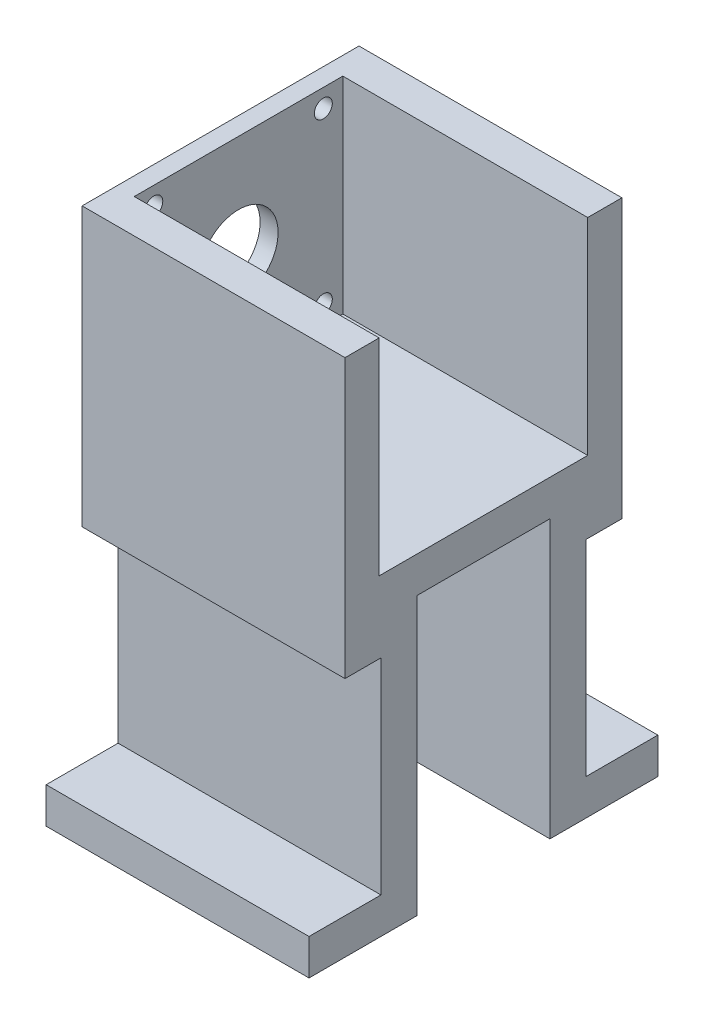
ISO-10303-21;
HEADER;
FILE_DESCRIPTION(('STEP AP214'),'2;1');
FILE_NAME('part.step','',(''),(''),'','','');
FILE_SCHEMA(('AUTOMOTIVE_DESIGN { 1 0 10303 214 1 1 1 1 }'));
ENDSEC;
DATA;
#1=APPLICATION_CONTEXT('core data for automotive mechanical design processes');
#2=APPLICATION_PROTOCOL_DEFINITION('international standard','automotive_design',2000,#1);
#3=PRODUCT_CONTEXT('',#1,'mechanical');
#4=PRODUCT('Part','Part','',(#3));
#5=PRODUCT_RELATED_PRODUCT_CATEGORY('part','',(#4));
#6=PRODUCT_DEFINITION_FORMATION('','',#4);
#7=PRODUCT_DEFINITION_CONTEXT('part definition',#1,'design');
#8=PRODUCT_DEFINITION('design','',#6,#7);
#9=PRODUCT_DEFINITION_SHAPE('','',#8);
#10=(LENGTH_UNIT() NAMED_UNIT(*) SI_UNIT(.MILLI.,.METRE.));
#11=(NAMED_UNIT(*) PLANE_ANGLE_UNIT() SI_UNIT($,.RADIAN.));
#12=(NAMED_UNIT(*) SI_UNIT($,.STERADIAN.) SOLID_ANGLE_UNIT());
#13=UNCERTAINTY_MEASURE_WITH_UNIT(LENGTH_MEASURE(1.E-05),#10,'distance_accuracy_value','');
#14=(GEOMETRIC_REPRESENTATION_CONTEXT(3) GLOBAL_UNCERTAINTY_ASSIGNED_CONTEXT((#13)) GLOBAL_UNIT_ASSIGNED_CONTEXT((#10,
#11,#12)) REPRESENTATION_CONTEXT('',''));
#15=CARTESIAN_POINT('',(0.,0.,0.));
#16=DIRECTION('',(0.,0.,1.));
#17=DIRECTION('',(1.,0.,0.));
#18=AXIS2_PLACEMENT_3D('',#15,#16,#17);
#19=CARTESIAN_POINT('',(34.05,-10.,57.));
#20=DIRECTION('',(-1.,0.,0.));
#21=DIRECTION('',(0.,-1.,0.));
#22=AXIS2_PLACEMENT_3D('',#19,#20,#21);
#23=PLANE('',#22);
#24=DIRECTION('',(0.,-1.,0.));
#25=VECTOR('',#24,1.);
#26=CARTESIAN_POINT('',(34.05,57.3,-0.5));
#27=LINE('',#26,#25);
#28=CARTESIAN_POINT('',(34.05,57.3,-0.5));
#29=VERTEX_POINT('',#28);
#30=CARTESIAN_POINT('',(34.05,0.,-0.5));
#31=VERTEX_POINT('',#30);
#32=EDGE_CURVE('E199',#29,#31,#27,.T.);
#33=ORIENTED_EDGE('',*,*,#32,.T.);
#34=DIRECTION('',(0.,0.,-1.));
#35=VECTOR('',#34,1.);
#36=CARTESIAN_POINT('',(34.05,0.,57.));
#37=LINE('',#36,#35);
#38=CARTESIAN_POINT('',(34.05,0.,57.5));
#39=VERTEX_POINT('',#38);
#40=EDGE_CURVE('E11',#39,#31,#37,.T.);
#41=ORIENTED_EDGE('',*,*,#40,.F.);
#42=DIRECTION('',(0.,-1.,0.));
#43=VECTOR('',#42,1.);
#44=CARTESIAN_POINT('',(34.05,57.3,57.5));
#45=LINE('',#44,#43);
#46=CARTESIAN_POINT('',(34.05,57.3,57.5));
#47=VERTEX_POINT('',#46);
#48=EDGE_CURVE('E205',#47,#39,#45,.T.);
#49=ORIENTED_EDGE('',*,*,#48,.F.);
#50=DIRECTION('',(0.,0.,-1.));
#51=VECTOR('',#50,1.);
#52=CARTESIAN_POINT('',(34.05,57.3,67.));
#53=LINE('',#52,#51);
#54=CARTESIAN_POINT('',(34.05,57.3,67.));
#55=VERTEX_POINT('',#54);
#56=EDGE_CURVE('E244',#55,#47,#53,.T.);
#57=ORIENTED_EDGE('',*,*,#56,.F.);
#58=DIRECTION('',(0.,-1.,0.));
#59=VECTOR('',#58,1.);
#60=CARTESIAN_POINT('',(34.05,57.3,67.));
#61=LINE('',#60,#59);
#62=CARTESIAN_POINT('',(34.05,-20.,67.));
#63=VERTEX_POINT('',#62);
#64=EDGE_CURVE('E238',#55,#63,#61,.T.);
#65=ORIENTED_EDGE('',*,*,#64,.T.);
#66=DIRECTION('',(0.,0.,-1.));
#67=VECTOR('',#66,1.);
#68=CARTESIAN_POINT('',(34.05,-20.,67.));
#69=LINE('',#68,#67);
#70=CARTESIAN_POINT('',(34.05,-20.,57.));
#71=VERTEX_POINT('',#70);
#72=EDGE_CURVE('E256',#63,#71,#69,.T.);
#73=ORIENTED_EDGE('',*,*,#72,.T.);
#74=DIRECTION('',(0.,1.,0.));
#75=VECTOR('',#74,1.);
#76=CARTESIAN_POINT('',(34.05,-10.,57.));
#77=LINE('',#76,#75);
#78=CARTESIAN_POINT('',(34.05,-77.1,57.));
#79=VERTEX_POINT('',#78);
#80=EDGE_CURVE('E38',#79,#71,#77,.T.);
#81=ORIENTED_EDGE('',*,*,#80,.F.);
#82=DIRECTION('',(0.,0.,-1.));
#83=VECTOR('',#82,1.);
#84=CARTESIAN_POINT('',(34.05,-77.1,77.));
#85=LINE('',#84,#83);
#86=CARTESIAN_POINT('',(34.05,-77.1,77.));
#87=VERTEX_POINT('',#86);
#88=EDGE_CURVE('E230',#87,#79,#85,.T.);
#89=ORIENTED_EDGE('',*,*,#88,.F.);
#90=DIRECTION('',(0.,-1.,0.));
#91=VECTOR('',#90,1.);
#92=CARTESIAN_POINT('',(34.05,-87.1,77.));
#93=LINE('',#92,#91);
#94=CARTESIAN_POINT('',(34.05,-87.1,77.));
#95=VERTEX_POINT('',#94);
#96=EDGE_CURVE('E214',#87,#95,#93,.T.);
#97=ORIENTED_EDGE('',*,*,#96,.T.);
#98=DIRECTION('',(0.,0.,1.));
#99=VECTOR('',#98,1.);
#100=CARTESIAN_POINT('',(34.05,-87.1,57.));
#101=LINE('',#100,#99);
#102=CARTESIAN_POINT('',(34.05,-87.1,47.));
#103=VERTEX_POINT('',#102);
#104=EDGE_CURVE('E322',#103,#95,#101,.T.);
#105=ORIENTED_EDGE('',*,*,#104,.F.);
#106=DIRECTION('',(0.,1.,0.));
#107=VECTOR('',#106,1.);
#108=CARTESIAN_POINT('',(34.05,-87.1,47.));
#109=LINE('',#108,#107);
#110=CARTESIAN_POINT('',(34.05,-10.,47.));
#111=VERTEX_POINT('',#110);
#112=EDGE_CURVE('E329',#103,#111,#109,.T.);
#113=ORIENTED_EDGE('',*,*,#112,.T.);
#114=DIRECTION('',(0.,0.,-1.));
#115=VECTOR('',#114,1.);
#116=CARTESIAN_POINT('',(34.05,-10.,57.));
#117=LINE('',#116,#115);
#118=CARTESIAN_POINT('',(34.05,-10.,10.));
#119=VERTEX_POINT('',#118);
#120=EDGE_CURVE('E282',#111,#119,#117,.T.);
#121=ORIENTED_EDGE('',*,*,#120,.T.);
#122=DIRECTION('',(0.,1.,0.));
#123=VECTOR('',#122,1.);
#124=CARTESIAN_POINT('',(34.05,-87.1,10.));
#125=LINE('',#124,#123);
#126=CARTESIAN_POINT('',(34.05,-87.1,10.));
#127=VERTEX_POINT('',#126);
#128=EDGE_CURVE('E354',#127,#119,#125,.T.);
#129=ORIENTED_EDGE('',*,*,#128,.F.);
#130=DIRECTION('',(0.,0.,1.));
#131=VECTOR('',#130,1.);
#132=CARTESIAN_POINT('',(34.05,-87.1,0.));
#133=LINE('',#132,#131);
#134=CARTESIAN_POINT('',(34.05,-87.1,-20.));
#135=VERTEX_POINT('',#134);
#136=EDGE_CURVE('E339',#135,#127,#133,.T.);
#137=ORIENTED_EDGE('',*,*,#136,.F.);
#138=DIRECTION('',(0.,-1.,0.));
#139=VECTOR('',#138,1.);
#140=CARTESIAN_POINT('',(34.05,-87.1,-20.));
#141=LINE('',#140,#139);
#142=CARTESIAN_POINT('',(34.05,-77.1,-20.));
#143=VERTEX_POINT('',#142);
#144=EDGE_CURVE('E313',#143,#135,#141,.T.);
#145=ORIENTED_EDGE('',*,*,#144,.F.);
#146=DIRECTION('',(0.,0.,1.));
#147=VECTOR('',#146,1.);
#148=CARTESIAN_POINT('',(34.05,-77.1,-20.));
#149=LINE('',#148,#147);
#150=CARTESIAN_POINT('',(34.05,-77.1,0.));
#151=VERTEX_POINT('',#150);
#152=EDGE_CURVE('E315',#143,#151,#149,.T.);
#153=ORIENTED_EDGE('',*,*,#152,.T.);
#154=DIRECTION('',(0.,1.,0.));
#155=VECTOR('',#154,1.);
#156=CARTESIAN_POINT('',(34.05,-10.,0.));
#157=LINE('',#156,#155);
#158=CARTESIAN_POINT('',(34.05,-20.,0.));
#159=VERTEX_POINT('',#158);
#160=EDGE_CURVE('E286',#151,#159,#157,.T.);
#161=ORIENTED_EDGE('',*,*,#160,.T.);
#162=DIRECTION('',(0.,0.,1.));
#163=VECTOR('',#162,1.);
#164=CARTESIAN_POINT('',(34.05,-20.,-10.));
#165=LINE('',#164,#163);
#166=CARTESIAN_POINT('',(34.05,-20.,-10.));
#167=VERTEX_POINT('',#166);
#168=EDGE_CURVE('E60',#167,#159,#165,.T.);
#169=ORIENTED_EDGE('',*,*,#168,.F.);
#170=DIRECTION('',(0.,-1.,0.));
#171=VECTOR('',#170,1.);
#172=CARTESIAN_POINT('',(34.05,57.3,-10.));
#173=LINE('',#172,#171);
#174=CARTESIAN_POINT('',(34.05,57.3,-10.));
#175=VERTEX_POINT('',#174);
#176=EDGE_CURVE('E435',#175,#167,#173,.T.);
#177=ORIENTED_EDGE('',*,*,#176,.F.);
#178=DIRECTION('',(0.,0.,1.));
#179=VECTOR('',#178,1.);
#180=CARTESIAN_POINT('',(34.05,57.3,-10.));
#181=LINE('',#180,#179);
#182=EDGE_CURVE('E314',#175,#29,#181,.T.);
#183=ORIENTED_EDGE('',*,*,#182,.T.);
#184=EDGE_LOOP('',(#33,#41,#49,#57,#65,#73,#81,#89,#97,#105,#113,#121,#129,#137,#145,#153,#161,
#169,#177,#183));
#185=FACE_BOUND('',#184,.T.);
#186=ADVANCED_FACE('F35',(#185),#23,.F.);
#187=CARTESIAN_POINT('',(-39.05,57.3,57.));
#188=DIRECTION('',(0.,-1.,0.));
#189=DIRECTION('',(0.,0.,-1.));
#190=AXIS2_PLACEMENT_3D('',#187,#188,#189);
#191=PLANE('',#190);
#192=DIRECTION('',(0.,0.,-1.));
#193=VECTOR('',#192,1.);
#194=CARTESIAN_POINT('',(-34.05,57.3,57.));
#195=LINE('',#194,#193);
#196=CARTESIAN_POINT('',(-34.05,57.3,57.5));
#197=VERTEX_POINT('',#196);
#198=CARTESIAN_POINT('',(-34.05,57.3,-0.5));
#199=VERTEX_POINT('',#198);
#200=EDGE_CURVE('E175',#197,#199,#195,.T.);
#201=ORIENTED_EDGE('',*,*,#200,.T.);
#202=DIRECTION('',(1.,0.,0.));
#203=VECTOR('',#202,1.);
#204=CARTESIAN_POINT('',(-34.05,57.3,-0.5));
#205=LINE('',#204,#203);
#206=EDGE_CURVE('E180',#199,#29,#205,.T.);
#207=ORIENTED_EDGE('',*,*,#206,.T.);
#208=ORIENTED_EDGE('',*,*,#182,.F.);
#209=DIRECTION('',(1.,0.,0.));
#210=VECTOR('',#209,1.);
#211=CARTESIAN_POINT('',(-39.05,57.3,-10.));
#212=LINE('',#211,#210);
#213=CARTESIAN_POINT('',(-39.05,57.3,-10.));
#214=VERTEX_POINT('',#213);
#215=EDGE_CURVE('E472',#214,#175,#212,.T.);
#216=ORIENTED_EDGE('',*,*,#215,.F.);
#217=DIRECTION('',(0.,0.,-1.));
#218=VECTOR('',#217,1.);
#219=CARTESIAN_POINT('',(-39.05,57.3,57.));
#220=LINE('',#219,#218);
#221=CARTESIAN_POINT('',(-39.05,57.3,67.));
#222=VERTEX_POINT('',#221);
#223=EDGE_CURVE('E187',#222,#214,#220,.T.);
#224=ORIENTED_EDGE('',*,*,#223,.F.);
#225=DIRECTION('',(1.,0.,0.));
#226=VECTOR('',#225,1.);
#227=CARTESIAN_POINT('',(-39.05,57.3,67.));
#228=LINE('',#227,#226);
#229=EDGE_CURVE('E241',#222,#55,#228,.T.);
#230=ORIENTED_EDGE('',*,*,#229,.T.);
#231=ORIENTED_EDGE('',*,*,#56,.T.);
#232=DIRECTION('',(1.,0.,0.));
#233=VECTOR('',#232,1.);
#234=CARTESIAN_POINT('',(-34.05,57.3,57.5));
#235=LINE('',#234,#233);
#236=EDGE_CURVE('E183',#197,#47,#235,.T.);
#237=ORIENTED_EDGE('',*,*,#236,.F.);
#238=EDGE_LOOP('',(#201,#207,#208,#216,#224,#230,#231,#237));
#239=FACE_BOUND('',#238,.T.);
#240=ADVANCED_FACE('F177',(#239),#191,.F.);
#241=CARTESIAN_POINT('',(0.,0.,0.));
#242=DIRECTION('',(0.,0.,-1.));
#243=DIRECTION('',(-1.,0.,0.));
#244=AXIS2_PLACEMENT_3D('',#241,#242,#243);
#245=PLANE('',#244);
#246=DIRECTION('',(0.,-1.,0.));
#247=VECTOR('',#246,1.);
#248=CARTESIAN_POINT('',(-39.05,57.3,0.));
#249=LINE('',#248,#247);
#250=CARTESIAN_POINT('',(-39.05,-20.,0.));
#251=VERTEX_POINT('',#250);
#252=CARTESIAN_POINT('',(-39.05,-77.1,0.));
#253=VERTEX_POINT('',#252);
#254=EDGE_CURVE('E285',#251,#253,#249,.T.);
#255=ORIENTED_EDGE('',*,*,#254,.F.);
#256=DIRECTION('',(-1.,0.,0.));
#257=VECTOR('',#256,1.);
#258=CARTESIAN_POINT('',(-39.05,-20.,0.));
#259=LINE('',#258,#257);
#260=EDGE_CURVE('E255',#159,#251,#259,.T.);
#261=ORIENTED_EDGE('',*,*,#260,.F.);
#262=ORIENTED_EDGE('',*,*,#160,.F.);
#263=DIRECTION('',(1.,0.,0.));
#264=VECTOR('',#263,1.);
#265=CARTESIAN_POINT('',(34.05,-77.1,0.));
#266=LINE('',#265,#264);
#267=EDGE_CURVE('E309',#253,#151,#266,.T.);
#268=ORIENTED_EDGE('',*,*,#267,.F.);
#269=EDGE_LOOP('',(#255,#261,#262,#268));
#270=FACE_BOUND('',#269,.T.);
#271=ADVANCED_FACE('F414',(#270),#245,.T.);
#272=CARTESIAN_POINT('',(29.05,-10.,57.));
#273=DIRECTION('',(0.,1.,0.));
#274=DIRECTION('',(-1.,0.,0.));
#275=AXIS2_PLACEMENT_3D('',#272,#273,#274);
#276=PLANE('',#275);
#277=DIRECTION('',(1.,0.,0.));
#278=VECTOR('',#277,1.);
#279=CARTESIAN_POINT('',(34.05,-10.,47.));
#280=LINE('',#279,#278);
#281=CARTESIAN_POINT('',(-39.05,-10.,47.));
#282=VERTEX_POINT('',#281);
#283=EDGE_CURVE('E325',#282,#111,#280,.T.);
#284=ORIENTED_EDGE('',*,*,#283,.F.);
#285=DIRECTION('',(0.,0.,-1.));
#286=VECTOR('',#285,1.);
#287=CARTESIAN_POINT('',(-39.05,-10.,57.));
#288=LINE('',#287,#286);
#289=CARTESIAN_POINT('',(-39.05,-10.,10.));
#290=VERTEX_POINT('',#289);
#291=EDGE_CURVE('E283',#282,#290,#288,.T.);
#292=ORIENTED_EDGE('',*,*,#291,.T.);
#293=DIRECTION('',(-1.,0.,0.));
#294=VECTOR('',#293,1.);
#295=CARTESIAN_POINT('',(-39.05,-10.,10.));
#296=LINE('',#295,#294);
#297=EDGE_CURVE('E336',#119,#290,#296,.T.);
#298=ORIENTED_EDGE('',*,*,#297,.F.);
#299=ORIENTED_EDGE('',*,*,#120,.F.);
#300=EDGE_LOOP('',(#284,#292,#298,#299));
#301=FACE_BOUND('',#300,.T.);
#302=ADVANCED_FACE('F419',(#301),#276,.F.);
#303=CARTESIAN_POINT('',(-34.05,0.,57.));
#304=DIRECTION('',(0.,-1.,0.));
#305=DIRECTION('',(0.,0.,-1.));
#306=AXIS2_PLACEMENT_3D('',#303,#304,#305);
#307=PLANE('',#306);
#308=ORIENTED_EDGE('',*,*,#40,.T.);
#309=DIRECTION('',(-1.,0.,0.));
#310=VECTOR('',#309,1.);
#311=CARTESIAN_POINT('',(34.05,0.,-0.5));
#312=LINE('',#311,#310);
#313=CARTESIAN_POINT('',(-34.05,0.,-0.5));
#314=VERTEX_POINT('',#313);
#315=EDGE_CURVE('E195',#31,#314,#312,.T.);
#316=ORIENTED_EDGE('',*,*,#315,.T.);
#317=DIRECTION('',(0.,0.,-1.));
#318=VECTOR('',#317,1.);
#319=CARTESIAN_POINT('',(-34.05,0.,57.));
#320=LINE('',#319,#318);
#321=CARTESIAN_POINT('',(-34.05,0.,57.5));
#322=VERTEX_POINT('',#321);
#323=EDGE_CURVE('E44',#322,#314,#320,.T.);
#324=ORIENTED_EDGE('',*,*,#323,.F.);
#325=DIRECTION('',(-1.,0.,0.));
#326=VECTOR('',#325,1.);
#327=CARTESIAN_POINT('',(34.05,0.,57.5));
#328=LINE('',#327,#326);
#329=EDGE_CURVE('E208',#39,#322,#328,.T.);
#330=ORIENTED_EDGE('',*,*,#329,.F.);
#331=EDGE_LOOP('',(#308,#316,#324,#330));
#332=FACE_BOUND('',#331,.T.);
#333=ADVANCED_FACE('F426',(#332),#307,.F.);
#334=CARTESIAN_POINT('',(-34.05,57.3,57.));
#335=DIRECTION('',(-1.,0.,0.));
#336=DIRECTION('',(0.,-1.,0.));
#337=AXIS2_PLACEMENT_3D('',#334,#335,#336);
#338=PLANE('',#337);
#339=CARTESIAN_POINT('',(-34.05,5.08,4.93));
#340=DIRECTION('',(-1.,0.,0.));
#341=DIRECTION('',(0.,-1.,0.));
#342=AXIS2_PLACEMENT_3D('',#339,#340,#341);
#343=CIRCLE('',#342,2.5);
#344=CARTESIAN_POINT('',(-34.05,2.58,4.93));
#345=VERTEX_POINT('',#344);
#346=EDGE_CURVE('E363',#345,#345,#343,.T.);
#347=ORIENTED_EDGE('',*,*,#346,.T.);
#348=EDGE_LOOP('',(#347));
#349=FACE_BOUND('',#348,.T.);
#350=CARTESIAN_POINT('',(-34.05,5.08,52.07));
#351=DIRECTION('',(-1.,0.,0.));
#352=DIRECTION('',(0.,-1.,0.));
#353=AXIS2_PLACEMENT_3D('',#350,#351,#352);
#354=CIRCLE('',#353,2.5);
#355=CARTESIAN_POINT('',(-34.05,2.58,52.07));
#356=VERTEX_POINT('',#355);
#357=EDGE_CURVE('E371',#356,#356,#354,.T.);
#358=ORIENTED_EDGE('',*,*,#357,.T.);
#359=EDGE_LOOP('',(#358));
#360=FACE_BOUND('',#359,.T.);
#361=CARTESIAN_POINT('',(-34.05,52.22,4.93));
#362=DIRECTION('',(-1.,0.,0.));
#363=DIRECTION('',(0.,-1.,0.));
#364=AXIS2_PLACEMENT_3D('',#361,#362,#363);
#365=CIRCLE('',#364,2.5);
#366=CARTESIAN_POINT('',(-34.05,49.72,4.93));
#367=VERTEX_POINT('',#366);
#368=EDGE_CURVE('E379',#367,#367,#365,.T.);
#369=ORIENTED_EDGE('',*,*,#368,.T.);
#370=EDGE_LOOP('',(#369));
#371=FACE_BOUND('',#370,.T.);
#372=CARTESIAN_POINT('',(-34.05,52.22,52.07));
#373=DIRECTION('',(-1.,0.,0.));
#374=DIRECTION('',(0.,-1.,0.));
#375=AXIS2_PLACEMENT_3D('',#372,#373,#374);
#376=CIRCLE('',#375,2.5);
#377=CARTESIAN_POINT('',(-34.05,49.72,52.07));
#378=VERTEX_POINT('',#377);
#379=EDGE_CURVE('E385',#378,#378,#376,.T.);
#380=ORIENTED_EDGE('',*,*,#379,.T.);
#381=EDGE_LOOP('',(#380));
#382=FACE_BOUND('',#381,.T.);
#383=CARTESIAN_POINT('',(-34.05,28.65,28.5));
#384=DIRECTION('',(-1.,0.,0.));
#385=DIRECTION('',(0.,-1.,0.));
#386=AXIS2_PLACEMENT_3D('',#383,#384,#385);
#387=CIRCLE('',#386,11.);
#388=CARTESIAN_POINT('',(-34.05,17.65,28.5));
#389=VERTEX_POINT('',#388);
#390=EDGE_CURVE('E292',#389,#389,#387,.T.);
#391=ORIENTED_EDGE('',*,*,#390,.T.);
#392=EDGE_LOOP('',(#391));
#393=FACE_BOUND('',#392,.T.);
#394=ORIENTED_EDGE('',*,*,#323,.T.);
#395=DIRECTION('',(0.,1.,0.));
#396=VECTOR('',#395,1.);
#397=CARTESIAN_POINT('',(-34.05,0.,-0.5));
#398=LINE('',#397,#396);
#399=EDGE_CURVE('E190',#314,#199,#398,.T.);
#400=ORIENTED_EDGE('',*,*,#399,.T.);
#401=ORIENTED_EDGE('',*,*,#200,.F.);
#402=DIRECTION('',(0.,1.,0.));
#403=VECTOR('',#402,1.);
#404=CARTESIAN_POINT('',(-34.05,0.,57.5));
#405=LINE('',#404,#403);
#406=EDGE_CURVE('E211',#322,#197,#405,.T.);
#407=ORIENTED_EDGE('',*,*,#406,.F.);
#408=EDGE_LOOP('',(#394,#400,#401,#407));
#409=FACE_BOUND('',#408,.T.);
#410=ADVANCED_FACE('F191',(#349,#360,#371,#382,#393,#409),#338,.F.);
#411=CARTESIAN_POINT('',(-39.05,57.3,57.));
#412=DIRECTION('',(1.,0.,0.));
#413=DIRECTION('',(0.,1.,0.));
#414=AXIS2_PLACEMENT_3D('',#411,#412,#413);
#415=PLANE('',#414);
#416=CARTESIAN_POINT('',(-39.05,5.08,4.93));
#417=DIRECTION('',(-1.,0.,0.));
#418=DIRECTION('',(0.,-1.,0.));
#419=AXIS2_PLACEMENT_3D('',#416,#417,#418);
#420=CIRCLE('',#419,2.5);
#421=CARTESIAN_POINT('',(-39.05,2.58,4.93));
#422=VERTEX_POINT('',#421);
#423=EDGE_CURVE('E346',#422,#422,#420,.T.);
#424=ORIENTED_EDGE('',*,*,#423,.F.);
#425=EDGE_LOOP('',(#424));
#426=FACE_BOUND('',#425,.T.);
#427=CARTESIAN_POINT('',(-39.05,5.08,52.07));
#428=DIRECTION('',(-1.,0.,0.));
#429=DIRECTION('',(0.,-1.,0.));
#430=AXIS2_PLACEMENT_3D('',#427,#428,#429);
#431=CIRCLE('',#430,2.5);
#432=CARTESIAN_POINT('',(-39.05,2.57999999999999,52.07));
#433=VERTEX_POINT('',#432);
#434=EDGE_CURVE('E367',#433,#433,#431,.T.);
#435=ORIENTED_EDGE('',*,*,#434,.F.);
#436=EDGE_LOOP('',(#435));
#437=FACE_BOUND('',#436,.T.);
#438=CARTESIAN_POINT('',(-39.05,52.22,4.93));
#439=DIRECTION('',(-1.,0.,0.));
#440=DIRECTION('',(0.,-1.,0.));
#441=AXIS2_PLACEMENT_3D('',#438,#439,#440);
#442=CIRCLE('',#441,2.5);
#443=CARTESIAN_POINT('',(-39.05,49.72,4.93));
#444=VERTEX_POINT('',#443);
#445=EDGE_CURVE('E376',#444,#444,#442,.T.);
#446=ORIENTED_EDGE('',*,*,#445,.F.);
#447=EDGE_LOOP('',(#446));
#448=FACE_BOUND('',#447,.T.);
#449=CARTESIAN_POINT('',(-39.05,52.22,52.07));
#450=DIRECTION('',(-1.,0.,0.));
#451=DIRECTION('',(0.,-1.,0.));
#452=AXIS2_PLACEMENT_3D('',#449,#450,#451);
#453=CIRCLE('',#452,2.5);
#454=CARTESIAN_POINT('',(-39.05,49.72,52.07));
#455=VERTEX_POINT('',#454);
#456=EDGE_CURVE('E382',#455,#455,#453,.T.);
#457=ORIENTED_EDGE('',*,*,#456,.F.);
#458=EDGE_LOOP('',(#457));
#459=FACE_BOUND('',#458,.T.);
#460=CARTESIAN_POINT('',(-39.05,28.65,28.5));
#461=DIRECTION('',(-1.,0.,0.));
#462=DIRECTION('',(0.,-1.,0.));
#463=AXIS2_PLACEMENT_3D('',#460,#461,#462);
#464=CIRCLE('',#463,11.);
#465=CARTESIAN_POINT('',(-39.05,17.65,28.5));
#466=VERTEX_POINT('',#465);
#467=EDGE_CURVE('E388',#466,#466,#464,.T.);
#468=ORIENTED_EDGE('',*,*,#467,.F.);
#469=EDGE_LOOP('',(#468));
#470=FACE_BOUND('',#469,.T.);
#471=ORIENTED_EDGE('',*,*,#223,.T.);
#472=DIRECTION('',(0.,1.,0.));
#473=VECTOR('',#472,1.);
#474=CARTESIAN_POINT('',(-39.05,57.3,-10.));
#475=LINE('',#474,#473);
#476=CARTESIAN_POINT('',(-39.05,-20.,-10.));
#477=VERTEX_POINT('',#476);
#478=EDGE_CURVE('E471',#477,#214,#475,.T.);
#479=ORIENTED_EDGE('',*,*,#478,.F.);
#480=DIRECTION('',(0.,0.,1.));
#481=VECTOR('',#480,1.);
#482=CARTESIAN_POINT('',(-39.05,-20.,-10.));
#483=LINE('',#482,#481);
#484=EDGE_CURVE('E438',#477,#251,#483,.T.);
#485=ORIENTED_EDGE('',*,*,#484,.T.);
#486=ORIENTED_EDGE('',*,*,#254,.T.);
#487=DIRECTION('',(0.,0.,1.));
#488=VECTOR('',#487,1.);
#489=CARTESIAN_POINT('',(-39.05,-77.1,-20.));
#490=LINE('',#489,#488);
#491=CARTESIAN_POINT('',(-39.05,-77.1,-20.));
#492=VERTEX_POINT('',#491);
#493=EDGE_CURVE('E331',#492,#253,#490,.T.);
#494=ORIENTED_EDGE('',*,*,#493,.F.);
#495=DIRECTION('',(0.,1.,0.));
#496=VECTOR('',#495,1.);
#497=CARTESIAN_POINT('',(-39.05,-87.1,-20.));
#498=LINE('',#497,#496);
#499=CARTESIAN_POINT('',(-39.05,-87.1,-20.));
#500=VERTEX_POINT('',#499);
#501=EDGE_CURVE('E446',#500,#492,#498,.T.);
#502=ORIENTED_EDGE('',*,*,#501,.F.);
#503=DIRECTION('',(0.,0.,-1.));
#504=VECTOR('',#503,1.);
#505=CARTESIAN_POINT('',(-39.05,-87.1,0.));
#506=LINE('',#505,#504);
#507=CARTESIAN_POINT('',(-39.05,-87.1,10.));
#508=VERTEX_POINT('',#507);
#509=EDGE_CURVE('E337',#508,#500,#506,.T.);
#510=ORIENTED_EDGE('',*,*,#509,.F.);
#511=DIRECTION('',(0.,1.,0.));
#512=VECTOR('',#511,1.);
#513=CARTESIAN_POINT('',(-39.05,-87.1,10.));
#514=LINE('',#513,#512);
#515=EDGE_CURVE('E343',#508,#290,#514,.T.);
#516=ORIENTED_EDGE('',*,*,#515,.T.);
#517=ORIENTED_EDGE('',*,*,#291,.F.);
#518=DIRECTION('',(0.,1.,0.));
#519=VECTOR('',#518,1.);
#520=CARTESIAN_POINT('',(-39.05,-87.1,47.));
#521=LINE('',#520,#519);
#522=CARTESIAN_POINT('',(-39.05,-87.1,47.));
#523=VERTEX_POINT('',#522);
#524=EDGE_CURVE('E334',#523,#282,#521,.T.);
#525=ORIENTED_EDGE('',*,*,#524,.F.);
#526=DIRECTION('',(0.,0.,-1.));
#527=VECTOR('',#526,1.);
#528=CARTESIAN_POINT('',(-39.05,-87.1,57.));
#529=LINE('',#528,#527);
#530=CARTESIAN_POINT('',(-39.05,-87.1,77.));
#531=VERTEX_POINT('',#530);
#532=EDGE_CURVE('E324',#531,#523,#529,.T.);
#533=ORIENTED_EDGE('',*,*,#532,.F.);
#534=DIRECTION('',(0.,1.,0.));
#535=VECTOR('',#534,1.);
#536=CARTESIAN_POINT('',(-39.05,-87.1,77.));
#537=LINE('',#536,#535);
#538=CARTESIAN_POINT('',(-39.05,-77.1,77.));
#539=VERTEX_POINT('',#538);
#540=EDGE_CURVE('E220',#531,#539,#537,.T.);
#541=ORIENTED_EDGE('',*,*,#540,.T.);
#542=DIRECTION('',(0.,0.,-1.));
#543=VECTOR('',#542,1.);
#544=CARTESIAN_POINT('',(-39.05,-77.1,77.));
#545=LINE('',#544,#543);
#546=CARTESIAN_POINT('',(-39.05,-77.1,57.));
#547=VERTEX_POINT('',#546);
#548=EDGE_CURVE('E226',#539,#547,#545,.T.);
#549=ORIENTED_EDGE('',*,*,#548,.T.);
#550=DIRECTION('',(0.,-1.,0.));
#551=VECTOR('',#550,1.);
#552=CARTESIAN_POINT('',(-39.05,57.3,57.));
#553=LINE('',#552,#551);
#554=CARTESIAN_POINT('',(-39.05,-20.,57.));
#555=VERTEX_POINT('',#554);
#556=EDGE_CURVE('E251',#555,#547,#553,.T.);
#557=ORIENTED_EDGE('',*,*,#556,.F.);
#558=DIRECTION('',(0.,0.,-1.));
#559=VECTOR('',#558,1.);
#560=CARTESIAN_POINT('',(-39.05,-20.,67.));
#561=LINE('',#560,#559);
#562=CARTESIAN_POINT('',(-39.05,-20.,67.));
#563=VERTEX_POINT('',#562);
#564=EDGE_CURVE('E52',#563,#555,#561,.T.);
#565=ORIENTED_EDGE('',*,*,#564,.F.);
#566=DIRECTION('',(0.,1.,0.));
#567=VECTOR('',#566,1.);
#568=CARTESIAN_POINT('',(-39.05,57.3,67.));
#569=LINE('',#568,#567);
#570=EDGE_CURVE('E233',#563,#222,#569,.T.);
#571=ORIENTED_EDGE('',*,*,#570,.T.);
#572=EDGE_LOOP('',(#471,#479,#485,#486,#494,#502,#510,#516,#517,#525,#533,#541,#549,#557,#565,#571));
#573=FACE_BOUND('',#572,.T.);
#574=ADVANCED_FACE('F280',(#426,#437,#448,#459,#470,#573),#415,.F.);
#575=CARTESIAN_POINT('',(0.,0.,57.));
#576=DIRECTION('',(0.,0.,-1.));
#577=DIRECTION('',(-1.,0.,0.));
#578=AXIS2_PLACEMENT_3D('',#575,#576,#577);
#579=PLANE('',#578);
#580=ORIENTED_EDGE('',*,*,#556,.T.);
#581=DIRECTION('',(1.,0.,0.));
#582=VECTOR('',#581,1.);
#583=CARTESIAN_POINT('',(34.05,-77.1,57.));
#584=LINE('',#583,#582);
#585=EDGE_CURVE('E213',#547,#79,#584,.T.);
#586=ORIENTED_EDGE('',*,*,#585,.T.);
#587=ORIENTED_EDGE('',*,*,#80,.T.);
#588=DIRECTION('',(-1.,0.,0.));
#589=VECTOR('',#588,1.);
#590=CARTESIAN_POINT('',(-39.05,-20.,57.));
#591=LINE('',#590,#589);
#592=EDGE_CURVE('E232',#71,#555,#591,.T.);
#593=ORIENTED_EDGE('',*,*,#592,.T.);
#594=EDGE_LOOP('',(#580,#586,#587,#593));
#595=FACE_BOUND('',#594,.T.);
#596=ADVANCED_FACE('F278',(#595),#579,.F.);
#597=CARTESIAN_POINT('',(3.95,28.65,28.5));
#598=DIRECTION('',(-1.,0.,0.));
#599=DIRECTION('',(0.,-1.,0.));
#600=AXIS2_PLACEMENT_3D('',#597,#598,#599);
#601=CYLINDRICAL_SURFACE('',#600,11.);
#602=ORIENTED_EDGE('',*,*,#467,.T.);
#603=EDGE_LOOP('',(#602));
#604=FACE_BOUND('',#603,.T.);
#605=ORIENTED_EDGE('',*,*,#390,.F.);
#606=EDGE_LOOP('',(#605));
#607=FACE_BOUND('',#606,.T.);
#608=ADVANCED_FACE('F397',(#604,#607),#601,.F.);
#609=CARTESIAN_POINT('',(3.95,52.22,52.07));
#610=DIRECTION('',(-1.,0.,0.));
#611=DIRECTION('',(0.,-1.,0.));
#612=AXIS2_PLACEMENT_3D('',#609,#610,#611);
#613=CYLINDRICAL_SURFACE('',#612,2.5);
#614=ORIENTED_EDGE('',*,*,#456,.T.);
#615=EDGE_LOOP('',(#614));
#616=FACE_BOUND('',#615,.T.);
#617=ORIENTED_EDGE('',*,*,#379,.F.);
#618=EDGE_LOOP('',(#617));
#619=FACE_BOUND('',#618,.T.);
#620=ADVANCED_FACE('F399',(#616,#619),#613,.F.);
#621=CARTESIAN_POINT('',(3.95,52.22,4.93));
#622=DIRECTION('',(-1.,0.,0.));
#623=DIRECTION('',(0.,-1.,0.));
#624=AXIS2_PLACEMENT_3D('',#621,#622,#623);
#625=CYLINDRICAL_SURFACE('',#624,2.5);
#626=ORIENTED_EDGE('',*,*,#445,.T.);
#627=EDGE_LOOP('',(#626));
#628=FACE_BOUND('',#627,.T.);
#629=ORIENTED_EDGE('',*,*,#368,.F.);
#630=EDGE_LOOP('',(#629));
#631=FACE_BOUND('',#630,.T.);
#632=ADVANCED_FACE('F406',(#628,#631),#625,.F.);
#633=CARTESIAN_POINT('',(3.95,5.08,52.07));
#634=DIRECTION('',(-1.,0.,0.));
#635=DIRECTION('',(0.,-1.,0.));
#636=AXIS2_PLACEMENT_3D('',#633,#634,#635);
#637=CYLINDRICAL_SURFACE('',#636,2.5);
#638=ORIENTED_EDGE('',*,*,#434,.T.);
#639=EDGE_LOOP('',(#638));
#640=FACE_BOUND('',#639,.T.);
#641=ORIENTED_EDGE('',*,*,#357,.F.);
#642=EDGE_LOOP('',(#641));
#643=FACE_BOUND('',#642,.T.);
#644=ADVANCED_FACE('F509',(#640,#643),#637,.F.);
#645=CARTESIAN_POINT('',(3.95,5.08,4.93));
#646=DIRECTION('',(-1.,0.,0.));
#647=DIRECTION('',(0.,-1.,0.));
#648=AXIS2_PLACEMENT_3D('',#645,#646,#647);
#649=CYLINDRICAL_SURFACE('',#648,2.5);
#650=ORIENTED_EDGE('',*,*,#423,.T.);
#651=EDGE_LOOP('',(#650));
#652=FACE_BOUND('',#651,.T.);
#653=ORIENTED_EDGE('',*,*,#346,.F.);
#654=EDGE_LOOP('',(#653));
#655=FACE_BOUND('',#654,.T.);
#656=ADVANCED_FACE('F506',(#652,#655),#649,.F.);
#657=CARTESIAN_POINT('',(-39.05,-87.1,10.));
#658=DIRECTION('',(0.,0.,-1.));
#659=DIRECTION('',(-1.,0.,0.));
#660=AXIS2_PLACEMENT_3D('',#657,#658,#659);
#661=PLANE('',#660);
#662=ORIENTED_EDGE('',*,*,#297,.T.);
#663=ORIENTED_EDGE('',*,*,#515,.F.);
#664=DIRECTION('',(-1.,0.,0.));
#665=VECTOR('',#664,1.);
#666=CARTESIAN_POINT('',(-39.05,-87.1,10.));
#667=LINE('',#666,#665);
#668=EDGE_CURVE('E341',#127,#508,#667,.T.);
#669=ORIENTED_EDGE('',*,*,#668,.F.);
#670=ORIENTED_EDGE('',*,*,#128,.T.);
#671=EDGE_LOOP('',(#662,#663,#669,#670));
#672=FACE_BOUND('',#671,.T.);
#673=ADVANCED_FACE('F466',(#672),#661,.F.);
#674=CARTESIAN_POINT('',(0.,-87.1,0.));
#675=DIRECTION('',(0.,1.,0.));
#676=DIRECTION('',(-1.,0.,0.));
#677=AXIS2_PLACEMENT_3D('',#674,#675,#676);
#678=PLANE('',#677);
#679=ORIENTED_EDGE('',*,*,#509,.T.);
#680=DIRECTION('',(-1.,0.,0.));
#681=VECTOR('',#680,1.);
#682=CARTESIAN_POINT('',(34.05,-87.1,-20.));
#683=LINE('',#682,#681);
#684=EDGE_CURVE('E444',#135,#500,#683,.T.);
#685=ORIENTED_EDGE('',*,*,#684,.F.);
#686=ORIENTED_EDGE('',*,*,#136,.T.);
#687=ORIENTED_EDGE('',*,*,#668,.T.);
#688=EDGE_LOOP('',(#679,#685,#686,#687));
#689=FACE_BOUND('',#688,.T.);
#690=ADVANCED_FACE('F462',(#689),#678,.F.);
#691=CARTESIAN_POINT('',(34.05,-87.1,47.));
#692=DIRECTION('',(0.,0.,1.));
#693=DIRECTION('',(1.,0.,0.));
#694=AXIS2_PLACEMENT_3D('',#691,#692,#693);
#695=PLANE('',#694);
#696=ORIENTED_EDGE('',*,*,#283,.T.);
#697=ORIENTED_EDGE('',*,*,#112,.F.);
#698=DIRECTION('',(1.,0.,0.));
#699=VECTOR('',#698,1.);
#700=CARTESIAN_POINT('',(34.05,-87.1,47.));
#701=LINE('',#700,#699);
#702=EDGE_CURVE('E327',#523,#103,#701,.T.);
#703=ORIENTED_EDGE('',*,*,#702,.F.);
#704=ORIENTED_EDGE('',*,*,#524,.T.);
#705=EDGE_LOOP('',(#696,#697,#703,#704));
#706=FACE_BOUND('',#705,.T.);
#707=ADVANCED_FACE('F497',(#706),#695,.F.);
#708=CARTESIAN_POINT('',(0.,-87.1,0.));
#709=DIRECTION('',(0.,1.,0.));
#710=DIRECTION('',(-1.,0.,0.));
#711=AXIS2_PLACEMENT_3D('',#708,#709,#710);
#712=PLANE('',#711);
#713=ORIENTED_EDGE('',*,*,#104,.T.);
#714=DIRECTION('',(-1.,0.,0.));
#715=VECTOR('',#714,1.);
#716=CARTESIAN_POINT('',(34.05,-87.1,77.));
#717=LINE('',#716,#715);
#718=EDGE_CURVE('E223',#95,#531,#717,.T.);
#719=ORIENTED_EDGE('',*,*,#718,.T.);
#720=ORIENTED_EDGE('',*,*,#532,.T.);
#721=ORIENTED_EDGE('',*,*,#702,.T.);
#722=EDGE_LOOP('',(#713,#719,#720,#721));
#723=FACE_BOUND('',#722,.T.);
#724=ADVANCED_FACE('F494',(#723),#712,.F.);
#725=CARTESIAN_POINT('',(34.05,-77.1,-20.));
#726=DIRECTION('',(0.,-1.,0.));
#727=DIRECTION('',(0.,0.,-1.));
#728=AXIS2_PLACEMENT_3D('',#725,#726,#727);
#729=PLANE('',#728);
#730=ORIENTED_EDGE('',*,*,#267,.T.);
#731=ORIENTED_EDGE('',*,*,#152,.F.);
#732=DIRECTION('',(1.,0.,0.));
#733=VECTOR('',#732,1.);
#734=CARTESIAN_POINT('',(34.05,-77.1,-20.));
#735=LINE('',#734,#733);
#736=EDGE_CURVE('E320',#492,#143,#735,.T.);
#737=ORIENTED_EDGE('',*,*,#736,.F.);
#738=ORIENTED_EDGE('',*,*,#493,.T.);
#739=EDGE_LOOP('',(#730,#731,#737,#738));
#740=FACE_BOUND('',#739,.T.);
#741=ADVANCED_FACE('F456',(#740),#729,.F.);
#742=CARTESIAN_POINT('',(0.,0.,-20.));
#743=DIRECTION('',(0.,0.,1.));
#744=DIRECTION('',(1.,0.,0.));
#745=AXIS2_PLACEMENT_3D('',#742,#743,#744);
#746=PLANE('',#745);
#747=ORIENTED_EDGE('',*,*,#144,.T.);
#748=ORIENTED_EDGE('',*,*,#684,.T.);
#749=ORIENTED_EDGE('',*,*,#501,.T.);
#750=ORIENTED_EDGE('',*,*,#736,.T.);
#751=EDGE_LOOP('',(#747,#748,#749,#750));
#752=FACE_BOUND('',#751,.T.);
#753=ADVANCED_FACE('F463',(#752),#746,.F.);
#754=CARTESIAN_POINT('',(-39.05,-20.,-10.));
#755=DIRECTION('',(0.,1.,0.));
#756=DIRECTION('',(-1.,0.,0.));
#757=AXIS2_PLACEMENT_3D('',#754,#755,#756);
#758=PLANE('',#757);
#759=ORIENTED_EDGE('',*,*,#260,.T.);
#760=ORIENTED_EDGE('',*,*,#484,.F.);
#761=DIRECTION('',(-1.,0.,0.));
#762=VECTOR('',#761,1.);
#763=CARTESIAN_POINT('',(-39.05,-20.,-10.));
#764=LINE('',#763,#762);
#765=EDGE_CURVE('E476',#167,#477,#764,.T.);
#766=ORIENTED_EDGE('',*,*,#765,.F.);
#767=ORIENTED_EDGE('',*,*,#168,.T.);
#768=EDGE_LOOP('',(#759,#760,#766,#767));
#769=FACE_BOUND('',#768,.T.);
#770=ADVANCED_FACE('F481',(#769),#758,.F.);
#771=CARTESIAN_POINT('',(0.,0.,-10.));
#772=DIRECTION('',(0.,0.,1.));
#773=DIRECTION('',(1.,0.,0.));
#774=AXIS2_PLACEMENT_3D('',#771,#772,#773);
#775=PLANE('',#774);
#776=ORIENTED_EDGE('',*,*,#478,.T.);
#777=ORIENTED_EDGE('',*,*,#215,.T.);
#778=ORIENTED_EDGE('',*,*,#176,.T.);
#779=ORIENTED_EDGE('',*,*,#765,.T.);
#780=EDGE_LOOP('',(#776,#777,#778,#779));
#781=FACE_BOUND('',#780,.T.);
#782=ADVANCED_FACE('F475',(#781),#775,.F.);
#783=CARTESIAN_POINT('',(-39.05,-20.,67.));
#784=DIRECTION('',(0.,-1.,0.));
#785=DIRECTION('',(1.,0.,0.));
#786=AXIS2_PLACEMENT_3D('',#783,#784,#785);
#787=PLANE('',#786);
#788=ORIENTED_EDGE('',*,*,#592,.F.);
#789=ORIENTED_EDGE('',*,*,#72,.F.);
#790=DIRECTION('',(-1.,0.,0.));
#791=VECTOR('',#790,1.);
#792=CARTESIAN_POINT('',(-39.05,-20.,67.));
#793=LINE('',#792,#791);
#794=EDGE_CURVE('E236',#63,#563,#793,.T.);
#795=ORIENTED_EDGE('',*,*,#794,.T.);
#796=ORIENTED_EDGE('',*,*,#564,.T.);
#797=EDGE_LOOP('',(#788,#789,#795,#796));
#798=FACE_BOUND('',#797,.T.);
#799=ADVANCED_FACE('F274',(#798),#787,.T.);
#800=CARTESIAN_POINT('',(0.,0.,67.));
#801=DIRECTION('',(0.,0.,-1.));
#802=DIRECTION('',(1.,0.,0.));
#803=AXIS2_PLACEMENT_3D('',#800,#801,#802);
#804=PLANE('',#803);
#805=ORIENTED_EDGE('',*,*,#570,.F.);
#806=ORIENTED_EDGE('',*,*,#794,.F.);
#807=ORIENTED_EDGE('',*,*,#64,.F.);
#808=ORIENTED_EDGE('',*,*,#229,.F.);
#809=EDGE_LOOP('',(#805,#806,#807,#808));
#810=FACE_BOUND('',#809,.T.);
#811=ADVANCED_FACE('F273',(#810),#804,.F.);
#812=CARTESIAN_POINT('',(34.05,-77.1,77.));
#813=DIRECTION('',(0.,1.,0.));
#814=DIRECTION('',(0.,0.,1.));
#815=AXIS2_PLACEMENT_3D('',#812,#813,#814);
#816=PLANE('',#815);
#817=ORIENTED_EDGE('',*,*,#585,.F.);
#818=ORIENTED_EDGE('',*,*,#548,.F.);
#819=DIRECTION('',(1.,0.,0.));
#820=VECTOR('',#819,1.);
#821=CARTESIAN_POINT('',(34.05,-77.1,77.));
#822=LINE('',#821,#820);
#823=EDGE_CURVE('E217',#539,#87,#822,.T.);
#824=ORIENTED_EDGE('',*,*,#823,.T.);
#825=ORIENTED_EDGE('',*,*,#88,.T.);
#826=EDGE_LOOP('',(#817,#818,#824,#825));
#827=FACE_BOUND('',#826,.T.);
#828=ADVANCED_FACE('F561',(#827),#816,.T.);
#829=CARTESIAN_POINT('',(0.,0.,77.));
#830=DIRECTION('',(0.,0.,-1.));
#831=DIRECTION('',(1.,0.,0.));
#832=AXIS2_PLACEMENT_3D('',#829,#830,#831);
#833=PLANE('',#832);
#834=ORIENTED_EDGE('',*,*,#96,.F.);
#835=ORIENTED_EDGE('',*,*,#823,.F.);
#836=ORIENTED_EDGE('',*,*,#540,.F.);
#837=ORIENTED_EDGE('',*,*,#718,.F.);
#838=EDGE_LOOP('',(#834,#835,#836,#837));
#839=FACE_BOUND('',#838,.T.);
#840=ADVANCED_FACE('F565',(#839),#833,.F.);
#841=CARTESIAN_POINT('',(0.,0.,57.5));
#842=DIRECTION('',(0.,0.,-1.));
#843=DIRECTION('',(-1.,0.,0.));
#844=AXIS2_PLACEMENT_3D('',#841,#842,#843);
#845=PLANE('',#844);
#846=ORIENTED_EDGE('',*,*,#236,.T.);
#847=ORIENTED_EDGE('',*,*,#48,.T.);
#848=ORIENTED_EDGE('',*,*,#329,.T.);
#849=ORIENTED_EDGE('',*,*,#406,.T.);
#850=EDGE_LOOP('',(#846,#847,#848,#849));
#851=FACE_BOUND('',#850,.T.);
#852=ADVANCED_FACE('F576',(#851),#845,.T.);
#853=CARTESIAN_POINT('',(0.,0.,-0.5));
#854=DIRECTION('',(0.,0.,1.));
#855=DIRECTION('',(-1.,0.,0.));
#856=AXIS2_PLACEMENT_3D('',#853,#854,#855);
#857=PLANE('',#856);
#858=ORIENTED_EDGE('',*,*,#206,.F.);
#859=ORIENTED_EDGE('',*,*,#399,.F.);
#860=ORIENTED_EDGE('',*,*,#315,.F.);
#861=ORIENTED_EDGE('',*,*,#32,.F.);
#862=EDGE_LOOP('',(#858,#859,#860,#861));
#863=FACE_BOUND('',#862,.T.);
#864=ADVANCED_FACE('F197',(#863),#857,.T.);
#865=CLOSED_SHELL('',(#186,#240,#271,#302,#333,#410,#574,#596,#608,#620,#632,#644,#656,#673,
#690,#707,#724,#741,#753,#770,#782,#799,#811,#828,#840,#852,#864));
#866=MANIFOLD_SOLID_BREP('B2',#865);
#867=ADVANCED_BREP_SHAPE_REPRESENTATION('',(#18,#866),#14);
#868=SHAPE_DEFINITION_REPRESENTATION(#9,#867);
ENDSEC;
END-ISO-10303-21;
